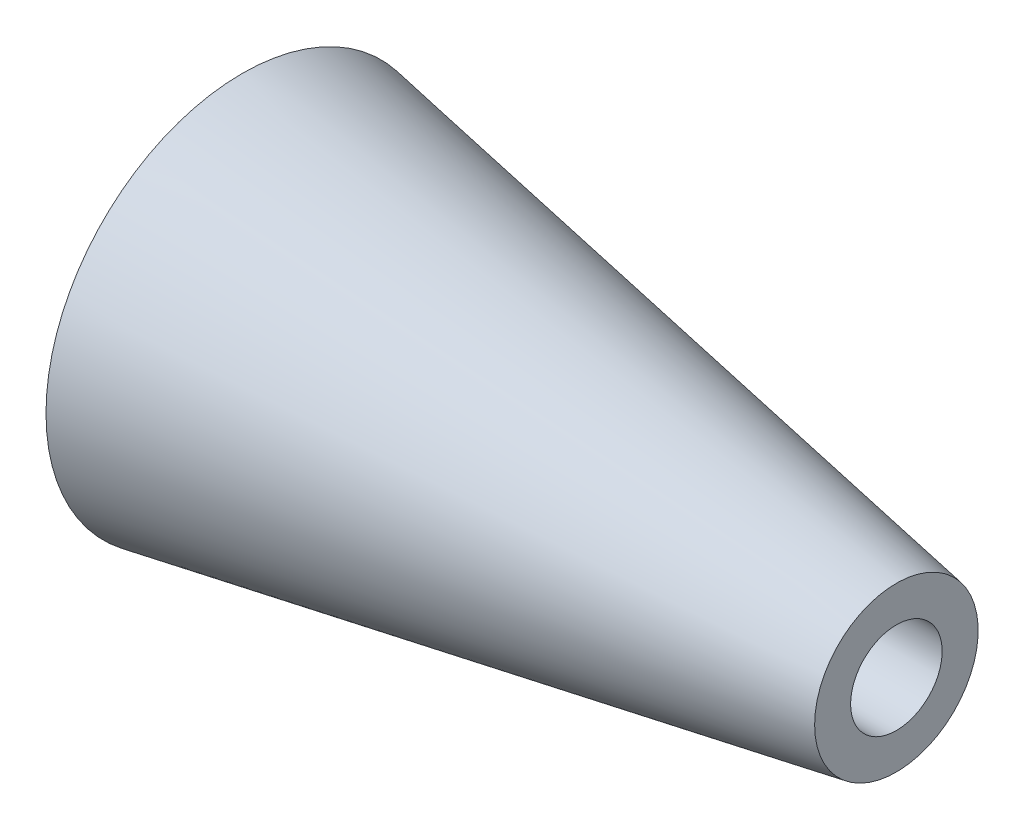
ISO-10303-21;
HEADER;
FILE_DESCRIPTION(('STEP AP214'),'2;1');
FILE_NAME('part.step','',(''),(''),'','','');
FILE_SCHEMA(('AUTOMOTIVE_DESIGN { 1 0 10303 214 1 1 1 1 }'));
ENDSEC;
DATA;
#1=APPLICATION_CONTEXT('core data for automotive mechanical design processes');
#2=APPLICATION_PROTOCOL_DEFINITION('international standard','automotive_design',2000,#1);
#3=PRODUCT_CONTEXT('',#1,'mechanical');
#4=PRODUCT('Part','Part','',(#3));
#5=PRODUCT_RELATED_PRODUCT_CATEGORY('part','',(#4));
#6=PRODUCT_DEFINITION_FORMATION('','',#4);
#7=PRODUCT_DEFINITION_CONTEXT('part definition',#1,'design');
#8=PRODUCT_DEFINITION('design','',#6,#7);
#9=PRODUCT_DEFINITION_SHAPE('','',#8);
#10=(LENGTH_UNIT() NAMED_UNIT(*) SI_UNIT(.MILLI.,.METRE.));
#11=(NAMED_UNIT(*) PLANE_ANGLE_UNIT() SI_UNIT($,.RADIAN.));
#12=(NAMED_UNIT(*) SI_UNIT($,.STERADIAN.) SOLID_ANGLE_UNIT());
#13=UNCERTAINTY_MEASURE_WITH_UNIT(LENGTH_MEASURE(1.E-05),#10,'distance_accuracy_value','');
#14=(GEOMETRIC_REPRESENTATION_CONTEXT(3) GLOBAL_UNCERTAINTY_ASSIGNED_CONTEXT((#13)) GLOBAL_UNIT_ASSIGNED_CONTEXT((#10,
#11,#12)) REPRESENTATION_CONTEXT('',''));
#15=CARTESIAN_POINT('',(0.,0.,0.));
#16=DIRECTION('',(0.,0.,1.));
#17=DIRECTION('',(1.,0.,0.));
#18=AXIS2_PLACEMENT_3D('',#15,#16,#17);
#19=CARTESIAN_POINT('',(0.,3.,0.));
#20=DIRECTION('',(1.,0.,0.));
#21=DIRECTION('',(0.,0.,-1.));
#22=AXIS2_PLACEMENT_3D('',#19,#20,#21);
#23=PLANE('',#22);
#24=CARTESIAN_POINT('',(0.,0.,0.));
#25=DIRECTION('',(-1.,0.,0.));
#26=DIRECTION('',(0.,0.,1.));
#27=AXIS2_PLACEMENT_3D('',#24,#25,#26);
#28=CIRCLE('',#27,0.7);
#29=CARTESIAN_POINT('',(0.,0.,0.7));
#30=VERTEX_POINT('',#29);
#31=EDGE_CURVE('E10',#30,#30,#28,.T.);
#32=ORIENTED_EDGE('',*,*,#31,.F.);
#33=EDGE_LOOP('',(#32));
#34=FACE_BOUND('',#33,.T.);
#35=CARTESIAN_POINT('',(0.,0.,0.));
#36=DIRECTION('',(-1.,0.,0.));
#37=DIRECTION('',(0.,0.,1.));
#38=AXIS2_PLACEMENT_3D('',#35,#36,#37);
#39=CIRCLE('',#38,3.);
#40=CARTESIAN_POINT('',(0.,0.,3.));
#41=VERTEX_POINT('',#40);
#42=EDGE_CURVE('E48',#41,#41,#39,.T.);
#43=ORIENTED_EDGE('',*,*,#42,.T.);
#44=EDGE_LOOP('',(#43));
#45=FACE_BOUND('',#44,.T.);
#46=ADVANCED_FACE('F34',(#34,#45),#23,.F.);
#47=CARTESIAN_POINT('',(0.,0.,0.));
#48=DIRECTION('',(-1.,0.,0.));
#49=DIRECTION('',(0.,0.,1.));
#50=AXIS2_PLACEMENT_3D('',#47,#48,#49);
#51=CYLINDRICAL_SURFACE('',#50,0.7);
#52=CARTESIAN_POINT('',(10.,0.,0.));
#53=DIRECTION('',(-1.,0.,0.));
#54=DIRECTION('',(0.,0.,1.));
#55=AXIS2_PLACEMENT_3D('',#52,#53,#54);
#56=CIRCLE('',#55,0.7);
#57=CARTESIAN_POINT('',(10.,0.,0.7));
#58=VERTEX_POINT('',#57);
#59=EDGE_CURVE('E40',#58,#58,#56,.T.);
#60=ORIENTED_EDGE('',*,*,#59,.F.);
#61=EDGE_LOOP('',(#60));
#62=FACE_BOUND('',#61,.T.);
#63=ORIENTED_EDGE('',*,*,#31,.T.);
#64=EDGE_LOOP('',(#63));
#65=FACE_BOUND('',#64,.T.);
#66=ADVANCED_FACE('F63',(#62,#65),#51,.F.);
#67=CARTESIAN_POINT('',(10.,0.7,0.));
#68=DIRECTION('',(-1.,0.,0.));
#69=DIRECTION('',(0.,0.,1.));
#70=AXIS2_PLACEMENT_3D('',#67,#68,#69);
#71=PLANE('',#70);
#72=CARTESIAN_POINT('',(10.,0.,0.));
#73=DIRECTION('',(-1.,0.,0.));
#74=DIRECTION('',(0.,0.,1.));
#75=AXIS2_PLACEMENT_3D('',#72,#73,#74);
#76=CIRCLE('',#75,1.25);
#77=CARTESIAN_POINT('',(10.,0.,1.25));
#78=VERTEX_POINT('',#77);
#79=EDGE_CURVE('E44',#78,#78,#76,.T.);
#80=ORIENTED_EDGE('',*,*,#79,.F.);
#81=EDGE_LOOP('',(#80));
#82=FACE_BOUND('',#81,.T.);
#83=ORIENTED_EDGE('',*,*,#59,.T.);
#84=EDGE_LOOP('',(#83));
#85=FACE_BOUND('',#84,.T.);
#86=ADVANCED_FACE('F58',(#82,#85),#71,.F.);
#87=CARTESIAN_POINT('',(10.,0.,0.));
#88=DIRECTION('',(-1.,0.,0.));
#89=DIRECTION('',(0.,0.,1.));
#90=AXIS2_PLACEMENT_3D('',#87,#88,#89);
#91=CONICAL_SURFACE('',#90,1.25,0.173245666452365);
#92=ORIENTED_EDGE('',*,*,#42,.F.);
#93=EDGE_LOOP('',(#92));
#94=FACE_BOUND('',#93,.T.);
#95=ORIENTED_EDGE('',*,*,#79,.T.);
#96=EDGE_LOOP('',(#95));
#97=FACE_BOUND('',#96,.T.);
#98=ADVANCED_FACE('F55',(#94,#97),#91,.T.);
#99=CLOSED_SHELL('',(#46,#66,#86,#98));
#100=MANIFOLD_SOLID_BREP('B2',#99);
#101=ADVANCED_BREP_SHAPE_REPRESENTATION('',(#18,#100),#14);
#102=SHAPE_DEFINITION_REPRESENTATION(#9,#101);
ENDSEC;
END-ISO-10303-21;
